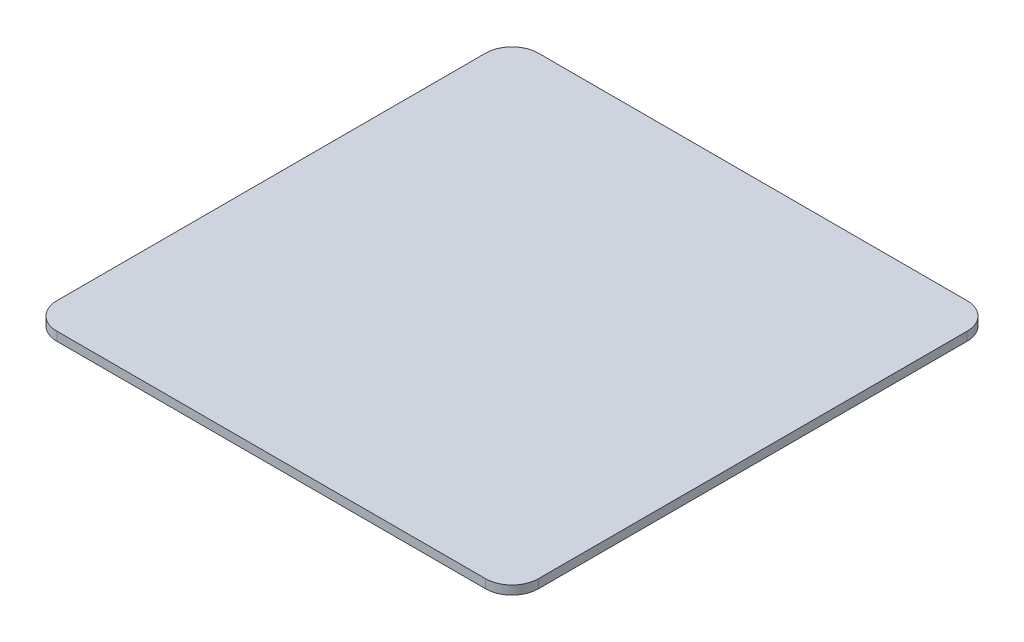
ISO-10303-21;
HEADER;
FILE_DESCRIPTION(('STEP AP214'),'2;1');
FILE_NAME('part.step','',(''),(''),'','','');
FILE_SCHEMA(('AUTOMOTIVE_DESIGN { 1 0 10303 214 1 1 1 1 }'));
ENDSEC;
DATA;
#1=APPLICATION_CONTEXT('core data for automotive mechanical design processes');
#2=APPLICATION_PROTOCOL_DEFINITION('international standard','automotive_design',2000,#1);
#3=PRODUCT_CONTEXT('',#1,'mechanical');
#4=PRODUCT('Part','Part','',(#3));
#5=PRODUCT_RELATED_PRODUCT_CATEGORY('part','',(#4));
#6=PRODUCT_DEFINITION_FORMATION('','',#4);
#7=PRODUCT_DEFINITION_CONTEXT('part definition',#1,'design');
#8=PRODUCT_DEFINITION('design','',#6,#7);
#9=PRODUCT_DEFINITION_SHAPE('','',#8);
#10=(LENGTH_UNIT() NAMED_UNIT(*) SI_UNIT(.MILLI.,.METRE.));
#11=(NAMED_UNIT(*) PLANE_ANGLE_UNIT() SI_UNIT($,.RADIAN.));
#12=(NAMED_UNIT(*) SI_UNIT($,.STERADIAN.) SOLID_ANGLE_UNIT());
#13=UNCERTAINTY_MEASURE_WITH_UNIT(LENGTH_MEASURE(1.E-05),#10,'distance_accuracy_value','');
#14=(GEOMETRIC_REPRESENTATION_CONTEXT(3) GLOBAL_UNCERTAINTY_ASSIGNED_CONTEXT((#13)) GLOBAL_UNIT_ASSIGNED_CONTEXT((#10,
#11,#12)) REPRESENTATION_CONTEXT('',''));
#15=CARTESIAN_POINT('',(0.,0.,0.));
#16=DIRECTION('',(0.,0.,1.));
#17=DIRECTION('',(1.,0.,0.));
#18=AXIS2_PLACEMENT_3D('',#15,#16,#17);
#19=CARTESIAN_POINT('',(-178.357036721238,58.7071385573017,508.995534569727));
#20=DIRECTION('',(0.,0.,-1.));
#21=DIRECTION('',(-1.,0.,0.));
#22=AXIS2_PLACEMENT_3D('',#19,#20,#21);
#23=PLANE('',#22);
#24=DIRECTION('',(1.,0.,0.));
#25=VECTOR('',#24,1.);
#26=CARTESIAN_POINT('',(-178.357036721238,50.7071385573017,508.995534569727));
#27=LINE('',#26,#25);
#28=CARTESIAN_POINT('',(-272.102036721238,50.7071385573017,508.995534569727));
#29=VERTEX_POINT('',#28);
#30=CARTESIAN_POINT('',(117.897963278762,50.7071385573017,508.995534569727));
#31=VERTEX_POINT('',#30);
#32=EDGE_CURVE('E93',#29,#31,#27,.T.);
#33=ORIENTED_EDGE('',*,*,#32,.T.);
#34=DIRECTION('',(0.,-1.,0.));
#35=VECTOR('',#34,1.);
#36=CARTESIAN_POINT('',(117.897963278762,58.7071385573017,508.995534569727));
#37=LINE('',#36,#35);
#38=CARTESIAN_POINT('',(117.897963278762,58.7071385573017,508.995534569727));
#39=VERTEX_POINT('',#38);
#40=EDGE_CURVE('E11',#39,#31,#37,.T.);
#41=ORIENTED_EDGE('',*,*,#40,.F.);
#42=DIRECTION('',(1.,0.,0.));
#43=VECTOR('',#42,1.);
#44=CARTESIAN_POINT('',(-272.102036721238,58.7071385573017,508.995534569727));
#45=LINE('',#44,#43);
#46=CARTESIAN_POINT('',(-272.102036721238,58.7071385573017,508.995534569727));
#47=VERTEX_POINT('',#46);
#48=EDGE_CURVE('E99',#47,#39,#45,.T.);
#49=ORIENTED_EDGE('',*,*,#48,.F.);
#50=DIRECTION('',(0.,-1.,0.));
#51=VECTOR('',#50,1.);
#52=CARTESIAN_POINT('',(-272.102036721238,58.7071385573017,508.995534569727));
#53=LINE('',#52,#51);
#54=EDGE_CURVE('E133',#47,#29,#53,.T.);
#55=ORIENTED_EDGE('',*,*,#54,.T.);
#56=EDGE_LOOP('',(#33,#41,#49,#55));
#57=FACE_BOUND('',#56,.T.);
#58=ADVANCED_FACE('F41',(#57),#23,.F.);
#59=CARTESIAN_POINT('',(117.897963278762,58.7071385573017,485.));
#60=DIRECTION('',(0.,-1.,0.));
#61=DIRECTION('',(0.,0.,-1.));
#62=AXIS2_PLACEMENT_3D('',#59,#60,#61);
#63=CYLINDRICAL_SURFACE('',#62,23.9955345697272);
#64=CARTESIAN_POINT('',(117.897963278762,50.7071385573017,485.));
#65=DIRECTION('',(0.,1.,0.));
#66=DIRECTION('',(0.,0.,1.));
#67=AXIS2_PLACEMENT_3D('',#64,#65,#66);
#68=CIRCLE('',#67,23.9955345697272);
#69=CARTESIAN_POINT('',(141.89349784849,50.7071385573017,485.));
#70=VERTEX_POINT('',#69);
#71=EDGE_CURVE('E138',#31,#70,#68,.T.);
#72=ORIENTED_EDGE('',*,*,#71,.T.);
#73=DIRECTION('',(0.,-1.,0.));
#74=VECTOR('',#73,1.);
#75=CARTESIAN_POINT('',(141.89349784849,58.7071385573017,485.));
#76=LINE('',#75,#74);
#77=CARTESIAN_POINT('',(141.89349784849,58.7071385573017,485.));
#78=VERTEX_POINT('',#77);
#79=EDGE_CURVE('E49',#78,#70,#76,.T.);
#80=ORIENTED_EDGE('',*,*,#79,.F.);
#81=CARTESIAN_POINT('',(117.897963278762,58.7071385573017,485.));
#82=DIRECTION('',(0.,1.,0.));
#83=DIRECTION('',(0.,0.,1.));
#84=AXIS2_PLACEMENT_3D('',#81,#82,#83);
#85=CIRCLE('',#84,23.9955345697272);
#86=EDGE_CURVE('E182',#39,#78,#85,.T.);
#87=ORIENTED_EDGE('',*,*,#86,.F.);
#88=ORIENTED_EDGE('',*,*,#40,.T.);
#89=EDGE_LOOP('',(#72,#80,#87,#88));
#90=FACE_BOUND('',#89,.T.);
#91=ADVANCED_FACE('F184',(#90),#63,.T.);
#92=CARTESIAN_POINT('',(141.89349784849,58.7071385573017,485.));
#93=DIRECTION('',(-1.,0.,0.));
#94=DIRECTION('',(0.,0.,1.));
#95=AXIS2_PLACEMENT_3D('',#92,#93,#94);
#96=PLANE('',#95);
#97=DIRECTION('',(0.,0.,-1.));
#98=VECTOR('',#97,1.);
#99=CARTESIAN_POINT('',(141.89349784849,50.7071385573017,485.));
#100=LINE('',#99,#98);
#101=CARTESIAN_POINT('',(141.89349784849,50.7071385573017,94.9999999999999));
#102=VERTEX_POINT('',#101);
#103=EDGE_CURVE('E140',#70,#102,#100,.T.);
#104=ORIENTED_EDGE('',*,*,#103,.T.);
#105=DIRECTION('',(0.,-1.,0.));
#106=VECTOR('',#105,1.);
#107=CARTESIAN_POINT('',(141.89349784849,58.7071385573017,94.9999999999999));
#108=LINE('',#107,#106);
#109=CARTESIAN_POINT('',(141.89349784849,58.7071385573017,94.9999999999999));
#110=VERTEX_POINT('',#109);
#111=EDGE_CURVE('E158',#110,#102,#108,.T.);
#112=ORIENTED_EDGE('',*,*,#111,.F.);
#113=DIRECTION('',(0.,0.,-1.));
#114=VECTOR('',#113,1.);
#115=CARTESIAN_POINT('',(141.89349784849,58.7071385573017,485.));
#116=LINE('',#115,#114);
#117=EDGE_CURVE('E167',#78,#110,#116,.T.);
#118=ORIENTED_EDGE('',*,*,#117,.F.);
#119=ORIENTED_EDGE('',*,*,#79,.T.);
#120=EDGE_LOOP('',(#104,#112,#118,#119));
#121=FACE_BOUND('',#120,.T.);
#122=ADVANCED_FACE('F165',(#121),#96,.F.);
#123=CARTESIAN_POINT('',(117.897963278762,58.7071385573017,94.9999999999999));
#124=DIRECTION('',(0.,-1.,0.));
#125=DIRECTION('',(0.,0.,-1.));
#126=AXIS2_PLACEMENT_3D('',#123,#124,#125);
#127=CYLINDRICAL_SURFACE('',#126,23.9955345697272);
#128=CARTESIAN_POINT('',(117.897963278762,50.7071385573017,94.9999999999999));
#129=DIRECTION('',(0.,1.,0.));
#130=DIRECTION('',(0.,0.,1.));
#131=AXIS2_PLACEMENT_3D('',#128,#129,#130);
#132=CIRCLE('',#131,23.9955345697272);
#133=CARTESIAN_POINT('',(117.897963278762,50.7071385573017,71.0044654302727));
#134=VERTEX_POINT('',#133);
#135=EDGE_CURVE('E142',#102,#134,#132,.T.);
#136=ORIENTED_EDGE('',*,*,#135,.T.);
#137=DIRECTION('',(0.,-1.,0.));
#138=VECTOR('',#137,1.);
#139=CARTESIAN_POINT('',(117.897963278762,58.7071385573017,71.0044654302727));
#140=LINE('',#139,#138);
#141=CARTESIAN_POINT('',(117.897963278762,58.7071385573017,71.0044654302727));
#142=VERTEX_POINT('',#141);
#143=EDGE_CURVE('E155',#142,#134,#140,.T.);
#144=ORIENTED_EDGE('',*,*,#143,.F.);
#145=CARTESIAN_POINT('',(117.897963278762,58.7071385573017,94.9999999999999));
#146=DIRECTION('',(0.,1.,0.));
#147=DIRECTION('',(0.,0.,1.));
#148=AXIS2_PLACEMENT_3D('',#145,#146,#147);
#149=CIRCLE('',#148,23.9955345697272);
#150=EDGE_CURVE('E178',#110,#142,#149,.T.);
#151=ORIENTED_EDGE('',*,*,#150,.F.);
#152=ORIENTED_EDGE('',*,*,#111,.T.);
#153=EDGE_LOOP('',(#136,#144,#151,#152));
#154=FACE_BOUND('',#153,.T.);
#155=ADVANCED_FACE('F174',(#154),#127,.T.);
#156=CARTESIAN_POINT('',(24.1529632787624,58.7071385573017,71.0044654302728));
#157=DIRECTION('',(0.,0.,1.));
#158=DIRECTION('',(1.,0.,0.));
#159=AXIS2_PLACEMENT_3D('',#156,#157,#158);
#160=PLANE('',#159);
#161=DIRECTION('',(-1.,0.,0.));
#162=VECTOR('',#161,1.);
#163=CARTESIAN_POINT('',(24.1529632787624,50.7071385573017,71.0044654302728));
#164=LINE('',#163,#162);
#165=CARTESIAN_POINT('',(-272.102036721238,50.7071385573017,71.0044654302727));
#166=VERTEX_POINT('',#165);
#167=EDGE_CURVE('E145',#134,#166,#164,.T.);
#168=ORIENTED_EDGE('',*,*,#167,.T.);
#169=DIRECTION('',(0.,-1.,0.));
#170=VECTOR('',#169,1.);
#171=CARTESIAN_POINT('',(-272.102036721238,58.7071385573017,71.0044654302727));
#172=LINE('',#171,#170);
#173=CARTESIAN_POINT('',(-272.102036721238,58.7071385573017,71.0044654302727));
#174=VERTEX_POINT('',#173);
#175=EDGE_CURVE('E128',#174,#166,#172,.T.);
#176=ORIENTED_EDGE('',*,*,#175,.F.);
#177=DIRECTION('',(-1.,0.,0.));
#178=VECTOR('',#177,1.);
#179=CARTESIAN_POINT('',(117.897963278762,58.7071385573017,71.0044654302727));
#180=LINE('',#179,#178);
#181=EDGE_CURVE('E119',#142,#174,#180,.T.);
#182=ORIENTED_EDGE('',*,*,#181,.F.);
#183=ORIENTED_EDGE('',*,*,#143,.T.);
#184=EDGE_LOOP('',(#168,#176,#182,#183));
#185=FACE_BOUND('',#184,.T.);
#186=ADVANCED_FACE('F177',(#185),#160,.F.);
#187=CARTESIAN_POINT('',(-272.102036721238,58.7071385573017,94.9999999999999));
#188=DIRECTION('',(0.,-1.,0.));
#189=DIRECTION('',(0.,0.,-1.));
#190=AXIS2_PLACEMENT_3D('',#187,#188,#189);
#191=CYLINDRICAL_SURFACE('',#190,23.9955345697271);
#192=CARTESIAN_POINT('',(-272.102036721238,50.7071385573017,94.9999999999999));
#193=DIRECTION('',(0.,1.,0.));
#194=DIRECTION('',(0.,0.,1.));
#195=AXIS2_PLACEMENT_3D('',#192,#193,#194);
#196=CIRCLE('',#195,23.9955345697271);
#197=CARTESIAN_POINT('',(-296.097571290965,50.7071385573017,94.9999999999999));
#198=VERTEX_POINT('',#197);
#199=EDGE_CURVE('E127',#166,#198,#196,.T.);
#200=ORIENTED_EDGE('',*,*,#199,.T.);
#201=DIRECTION('',(0.,-1.,0.));
#202=VECTOR('',#201,1.);
#203=CARTESIAN_POINT('',(-296.097571290965,58.7071385573017,94.9999999999999));
#204=LINE('',#203,#202);
#205=CARTESIAN_POINT('',(-296.097571290965,58.7071385573017,94.9999999999999));
#206=VERTEX_POINT('',#205);
#207=EDGE_CURVE('E124',#206,#198,#204,.T.);
#208=ORIENTED_EDGE('',*,*,#207,.F.);
#209=CARTESIAN_POINT('',(-272.102036721238,58.7071385573017,94.9999999999999));
#210=DIRECTION('',(0.,1.,0.));
#211=DIRECTION('',(0.,0.,1.));
#212=AXIS2_PLACEMENT_3D('',#209,#210,#211);
#213=CIRCLE('',#212,23.9955345697271);
#214=EDGE_CURVE('E113',#174,#206,#213,.T.);
#215=ORIENTED_EDGE('',*,*,#214,.F.);
#216=ORIENTED_EDGE('',*,*,#175,.T.);
#217=EDGE_LOOP('',(#200,#208,#215,#216));
#218=FACE_BOUND('',#217,.T.);
#219=ADVANCED_FACE('F125',(#218),#191,.T.);
#220=CARTESIAN_POINT('',(-296.097571290965,58.7071385573017,94.9999999999999));
#221=DIRECTION('',(1.,0.,0.));
#222=DIRECTION('',(0.,0.,-1.));
#223=AXIS2_PLACEMENT_3D('',#220,#221,#222);
#224=PLANE('',#223);
#225=DIRECTION('',(0.,0.,1.));
#226=VECTOR('',#225,1.);
#227=CARTESIAN_POINT('',(-296.097571290965,50.7071385573017,94.9999999999999));
#228=LINE('',#227,#226);
#229=CARTESIAN_POINT('',(-296.097571290965,50.7071385573017,485.));
#230=VERTEX_POINT('',#229);
#231=EDGE_CURVE('E86',#198,#230,#228,.T.);
#232=ORIENTED_EDGE('',*,*,#231,.T.);
#233=DIRECTION('',(0.,-1.,0.));
#234=VECTOR('',#233,1.);
#235=CARTESIAN_POINT('',(-296.097571290965,58.7071385573017,485.));
#236=LINE('',#235,#234);
#237=CARTESIAN_POINT('',(-296.097571290965,58.7071385573017,485.));
#238=VERTEX_POINT('',#237);
#239=EDGE_CURVE('E129',#238,#230,#236,.T.);
#240=ORIENTED_EDGE('',*,*,#239,.F.);
#241=DIRECTION('',(0.,0.,1.));
#242=VECTOR('',#241,1.);
#243=CARTESIAN_POINT('',(-296.097571290965,58.7071385573017,94.9999999999999));
#244=LINE('',#243,#242);
#245=EDGE_CURVE('E117',#206,#238,#244,.T.);
#246=ORIENTED_EDGE('',*,*,#245,.F.);
#247=ORIENTED_EDGE('',*,*,#207,.T.);
#248=EDGE_LOOP('',(#232,#240,#246,#247));
#249=FACE_BOUND('',#248,.T.);
#250=ADVANCED_FACE('F131',(#249),#224,.F.);
#251=CARTESIAN_POINT('',(-272.102036721238,58.7071385573017,485.));
#252=DIRECTION('',(0.,-1.,0.));
#253=DIRECTION('',(0.,0.,-1.));
#254=AXIS2_PLACEMENT_3D('',#251,#252,#253);
#255=CYLINDRICAL_SURFACE('',#254,23.9955345697271);
#256=CARTESIAN_POINT('',(-272.102036721238,50.7071385573017,485.));
#257=DIRECTION('',(0.,1.,0.));
#258=DIRECTION('',(0.,0.,1.));
#259=AXIS2_PLACEMENT_3D('',#256,#257,#258);
#260=CIRCLE('',#259,23.9955345697271);
#261=EDGE_CURVE('E149',#230,#29,#260,.T.);
#262=ORIENTED_EDGE('',*,*,#261,.T.);
#263=ORIENTED_EDGE('',*,*,#54,.F.);
#264=CARTESIAN_POINT('',(-272.102036721238,58.7071385573017,485.));
#265=DIRECTION('',(0.,1.,0.));
#266=DIRECTION('',(0.,0.,1.));
#267=AXIS2_PLACEMENT_3D('',#264,#265,#266);
#268=CIRCLE('',#267,23.9955345697271);
#269=EDGE_CURVE('E57',#238,#47,#268,.T.);
#270=ORIENTED_EDGE('',*,*,#269,.F.);
#271=ORIENTED_EDGE('',*,*,#239,.T.);
#272=EDGE_LOOP('',(#262,#263,#270,#271));
#273=FACE_BOUND('',#272,.T.);
#274=ADVANCED_FACE('F187',(#273),#255,.T.);
#275=CARTESIAN_POINT('',(117.897963278762,58.7071385573017,485.));
#276=DIRECTION('',(0.,1.,0.));
#277=DIRECTION('',(0.,0.,1.));
#278=AXIS2_PLACEMENT_3D('',#275,#276,#277);
#279=PLANE('',#278);
#280=ORIENTED_EDGE('',*,*,#48,.T.);
#281=ORIENTED_EDGE('',*,*,#86,.T.);
#282=ORIENTED_EDGE('',*,*,#117,.T.);
#283=ORIENTED_EDGE('',*,*,#150,.T.);
#284=ORIENTED_EDGE('',*,*,#181,.T.);
#285=ORIENTED_EDGE('',*,*,#214,.T.);
#286=ORIENTED_EDGE('',*,*,#245,.T.);
#287=ORIENTED_EDGE('',*,*,#269,.T.);
#288=EDGE_LOOP('',(#280,#281,#282,#283,#284,#285,#286,#287));
#289=FACE_BOUND('',#288,.T.);
#290=ADVANCED_FACE('F115',(#289),#279,.T.);
#291=CARTESIAN_POINT('',(117.897963278762,50.7071385573017,485.));
#292=DIRECTION('',(0.,1.,0.));
#293=DIRECTION('',(0.,0.,1.));
#294=AXIS2_PLACEMENT_3D('',#291,#292,#293);
#295=PLANE('',#294);
#296=ORIENTED_EDGE('',*,*,#32,.F.);
#297=ORIENTED_EDGE('',*,*,#261,.F.);
#298=ORIENTED_EDGE('',*,*,#231,.F.);
#299=ORIENTED_EDGE('',*,*,#199,.F.);
#300=ORIENTED_EDGE('',*,*,#167,.F.);
#301=ORIENTED_EDGE('',*,*,#135,.F.);
#302=ORIENTED_EDGE('',*,*,#103,.F.);
#303=ORIENTED_EDGE('',*,*,#71,.F.);
#304=EDGE_LOOP('',(#296,#297,#298,#299,#300,#301,#302,#303));
#305=FACE_BOUND('',#304,.T.);
#306=ADVANCED_FACE('F171',(#305),#295,.F.);
#307=CLOSED_SHELL('',(#58,#91,#122,#155,#186,#219,#250,#274,#290,#306));
#308=MANIFOLD_SOLID_BREP('B2',#307);
#309=ADVANCED_BREP_SHAPE_REPRESENTATION('',(#18,#308),#14);
#310=SHAPE_DEFINITION_REPRESENTATION(#9,#309);
ENDSEC;
END-ISO-10303-21;
